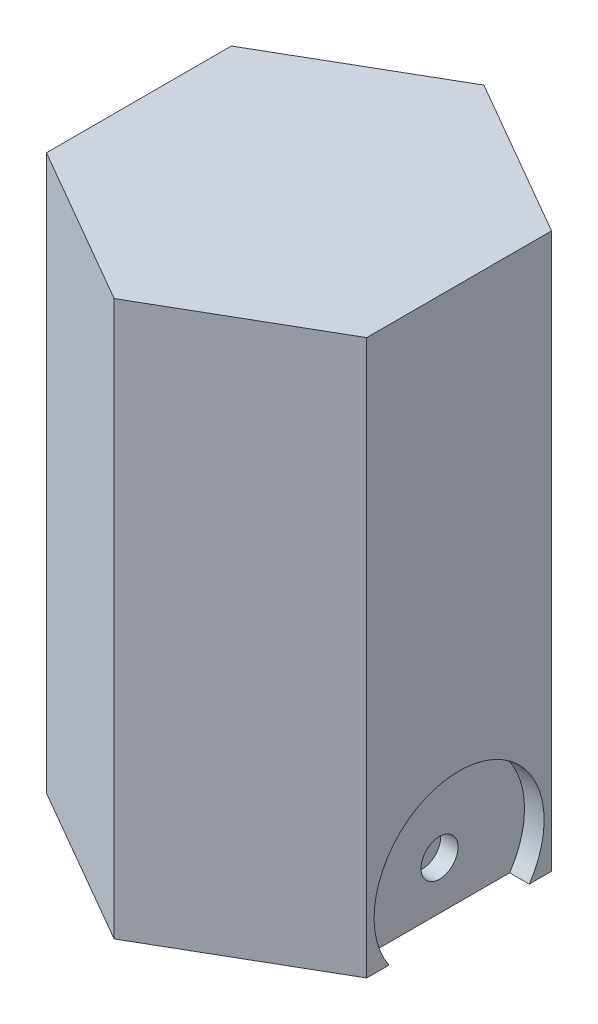
ISO-10303-21;
HEADER;
FILE_DESCRIPTION(('STEP AP214'),'2;1');
FILE_NAME('part.step','',(''),(''),'','','');
FILE_SCHEMA(('AUTOMOTIVE_DESIGN { 1 0 10303 214 1 1 1 1 }'));
ENDSEC;
DATA;
#1=APPLICATION_CONTEXT('core data for automotive mechanical design processes');
#2=APPLICATION_PROTOCOL_DEFINITION('international standard','automotive_design',2000,#1);
#3=PRODUCT_CONTEXT('',#1,'mechanical');
#4=PRODUCT('Part','Part','',(#3));
#5=PRODUCT_RELATED_PRODUCT_CATEGORY('part','',(#4));
#6=PRODUCT_DEFINITION_FORMATION('','',#4);
#7=PRODUCT_DEFINITION_CONTEXT('part definition',#1,'design');
#8=PRODUCT_DEFINITION('design','',#6,#7);
#9=PRODUCT_DEFINITION_SHAPE('','',#8);
#10=(LENGTH_UNIT() NAMED_UNIT(*) SI_UNIT(.MILLI.,.METRE.));
#11=(NAMED_UNIT(*) PLANE_ANGLE_UNIT() SI_UNIT($,.RADIAN.));
#12=(NAMED_UNIT(*) SI_UNIT($,.STERADIAN.) SOLID_ANGLE_UNIT());
#13=UNCERTAINTY_MEASURE_WITH_UNIT(LENGTH_MEASURE(1.E-05),#10,'distance_accuracy_value','');
#14=(GEOMETRIC_REPRESENTATION_CONTEXT(3) GLOBAL_UNCERTAINTY_ASSIGNED_CONTEXT((#13)) GLOBAL_UNIT_ASSIGNED_CONTEXT((#10,
#11,#12)) REPRESENTATION_CONTEXT('',''));
#15=CARTESIAN_POINT('',(0.,0.,0.));
#16=DIRECTION('',(0.,0.,1.));
#17=DIRECTION('',(1.,0.,0.));
#18=AXIS2_PLACEMENT_3D('',#15,#16,#17);
#19=CARTESIAN_POINT('',(43.3012701892219,160.,-25.));
#20=DIRECTION('',(-0.5,0.,0.866025403784439));
#21=DIRECTION('',(0.866025403784439,0.,0.5));
#22=AXIS2_PLACEMENT_3D('',#19,#20,#21);
#23=PLANE('',#22);
#24=DIRECTION('',(-0.866025403784439,0.,-0.5));
#25=VECTOR('',#24,1.);
#26=CARTESIAN_POINT('',(43.3012701892219,10.,-25.));
#27=LINE('',#26,#25);
#28=CARTESIAN_POINT('',(43.3012701892219,10.,-25.));
#29=VERTEX_POINT('',#28);
#30=CARTESIAN_POINT('',(0.,10.,-50.));
#31=VERTEX_POINT('',#30);
#32=EDGE_CURVE('E138',#29,#31,#27,.T.);
#33=ORIENTED_EDGE('',*,*,#32,.T.);
#34=DIRECTION('',(0.,-1.,0.));
#35=VECTOR('',#34,1.);
#36=CARTESIAN_POINT('',(0.,160.,-50.));
#37=LINE('',#36,#35);
#38=CARTESIAN_POINT('',(0.,160.,-50.));
#39=VERTEX_POINT('',#38);
#40=EDGE_CURVE('E182',#39,#31,#37,.T.);
#41=ORIENTED_EDGE('',*,*,#40,.F.);
#42=DIRECTION('',(-0.866025403784439,0.,-0.5));
#43=VECTOR('',#42,1.);
#44=CARTESIAN_POINT('',(43.3012701892219,160.,-25.));
#45=LINE('',#44,#43);
#46=CARTESIAN_POINT('',(43.3012701892219,160.,-25.));
#47=VERTEX_POINT('',#46);
#48=EDGE_CURVE('E139',#47,#39,#45,.T.);
#49=ORIENTED_EDGE('',*,*,#48,.F.);
#50=DIRECTION('',(0.,-1.,0.));
#51=VECTOR('',#50,1.);
#52=CARTESIAN_POINT('',(43.3012701892219,160.,-25.));
#53=LINE('',#52,#51);
#54=EDGE_CURVE('E153',#47,#29,#53,.T.);
#55=ORIENTED_EDGE('',*,*,#54,.T.);
#56=EDGE_LOOP('',(#33,#41,#49,#55));
#57=FACE_BOUND('',#56,.T.);
#58=ADVANCED_FACE('F32',(#57),#23,.F.);
#59=CARTESIAN_POINT('',(0.,160.,-50.));
#60=DIRECTION('',(0.5,0.,0.866025403784439));
#61=DIRECTION('',(0.866025403784439,0.,-0.5));
#62=AXIS2_PLACEMENT_3D('',#59,#60,#61);
#63=PLANE('',#62);
#64=DIRECTION('',(-0.866025403784439,0.,0.5));
#65=VECTOR('',#64,1.);
#66=CARTESIAN_POINT('',(0.,10.,-50.));
#67=LINE('',#66,#65);
#68=CARTESIAN_POINT('',(-43.3012701892219,10.,-25.));
#69=VERTEX_POINT('',#68);
#70=EDGE_CURVE('E156',#31,#69,#67,.T.);
#71=ORIENTED_EDGE('',*,*,#70,.T.);
#72=DIRECTION('',(0.,-1.,0.));
#73=VECTOR('',#72,1.);
#74=CARTESIAN_POINT('',(-43.3012701892219,160.,-25.));
#75=LINE('',#74,#73);
#76=CARTESIAN_POINT('',(-43.3012701892219,160.,-25.));
#77=VERTEX_POINT('',#76);
#78=EDGE_CURVE('E179',#77,#69,#75,.T.);
#79=ORIENTED_EDGE('',*,*,#78,.F.);
#80=DIRECTION('',(-0.866025403784439,0.,0.5));
#81=VECTOR('',#80,1.);
#82=CARTESIAN_POINT('',(0.,160.,-50.));
#83=LINE('',#82,#81);
#84=EDGE_CURVE('E142',#39,#77,#83,.T.);
#85=ORIENTED_EDGE('',*,*,#84,.F.);
#86=ORIENTED_EDGE('',*,*,#40,.T.);
#87=EDGE_LOOP('',(#71,#79,#85,#86));
#88=FACE_BOUND('',#87,.T.);
#89=ADVANCED_FACE('F198',(#88),#63,.F.);
#90=CARTESIAN_POINT('',(-43.3012701892219,160.,-25.));
#91=DIRECTION('',(1.,0.,0.));
#92=DIRECTION('',(0.,0.,-1.));
#93=AXIS2_PLACEMENT_3D('',#90,#91,#92);
#94=PLANE('',#93);
#95=DIRECTION('',(0.,0.,1.));
#96=VECTOR('',#95,1.);
#97=CARTESIAN_POINT('',(-43.3012701892219,10.,-25.));
#98=LINE('',#97,#96);
#99=CARTESIAN_POINT('',(-43.3012701892219,10.,-18.9736659610103));
#100=VERTEX_POINT('',#99);
#101=EDGE_CURVE('E159',#69,#100,#98,.T.);
#102=ORIENTED_EDGE('',*,*,#101,.T.);
#103=CARTESIAN_POINT('',(-43.3012701892219,23.,0.));
#104=DIRECTION('',(1.,0.,0.));
#105=DIRECTION('',(0.,0.,-1.));
#106=AXIS2_PLACEMENT_3D('',#103,#104,#105);
#107=CIRCLE('',#106,23.);
#108=CARTESIAN_POINT('',(-43.3012701892219,10.,18.9736659610103));
#109=VERTEX_POINT('',#108);
#110=EDGE_CURVE('E136',#109,#100,#107,.F.);
#111=ORIENTED_EDGE('',*,*,#110,.F.);
#112=CARTESIAN_POINT('',(-43.3012701892219,10.,25.));
#113=VERTEX_POINT('',#112);
#114=EDGE_CURVE('E158',#109,#113,#98,.T.);
#115=ORIENTED_EDGE('',*,*,#114,.T.);
#116=DIRECTION('',(0.,-1.,0.));
#117=VECTOR('',#116,1.);
#118=CARTESIAN_POINT('',(-43.3012701892219,160.,25.));
#119=LINE('',#118,#117);
#120=CARTESIAN_POINT('',(-43.3012701892219,160.,25.));
#121=VERTEX_POINT('',#120);
#122=EDGE_CURVE('E176',#121,#113,#119,.T.);
#123=ORIENTED_EDGE('',*,*,#122,.F.);
#124=DIRECTION('',(0.,0.,1.));
#125=VECTOR('',#124,1.);
#126=CARTESIAN_POINT('',(-43.3012701892219,160.,-25.));
#127=LINE('',#126,#125);
#128=EDGE_CURVE('E145',#77,#121,#127,.T.);
#129=ORIENTED_EDGE('',*,*,#128,.F.);
#130=ORIENTED_EDGE('',*,*,#78,.T.);
#131=EDGE_LOOP('',(#102,#111,#115,#123,#129,#130));
#132=FACE_BOUND('',#131,.T.);
#133=ADVANCED_FACE('F192',(#132),#94,.F.);
#134=CARTESIAN_POINT('',(-43.3012701892219,160.,25.));
#135=DIRECTION('',(0.5,0.,-0.866025403784438));
#136=DIRECTION('',(-0.866025403784439,0.,-0.5));
#137=AXIS2_PLACEMENT_3D('',#134,#135,#136);
#138=PLANE('',#137);
#139=DIRECTION('',(0.866025403784438,0.,0.5));
#140=VECTOR('',#139,1.);
#141=CARTESIAN_POINT('',(-43.3012701892219,10.,25.));
#142=LINE('',#141,#140);
#143=CARTESIAN_POINT('',(0.,10.,50.));
#144=VERTEX_POINT('',#143);
#145=EDGE_CURVE('E162',#113,#144,#142,.T.);
#146=ORIENTED_EDGE('',*,*,#145,.T.);
#147=DIRECTION('',(0.,-1.,0.));
#148=VECTOR('',#147,1.);
#149=CARTESIAN_POINT('',(0.,160.,50.));
#150=LINE('',#149,#148);
#151=CARTESIAN_POINT('',(0.,160.,50.));
#152=VERTEX_POINT('',#151);
#153=EDGE_CURVE('E173',#152,#144,#150,.T.);
#154=ORIENTED_EDGE('',*,*,#153,.F.);
#155=DIRECTION('',(0.866025403784438,0.,0.5));
#156=VECTOR('',#155,1.);
#157=CARTESIAN_POINT('',(-43.3012701892219,160.,25.));
#158=LINE('',#157,#156);
#159=EDGE_CURVE('E147',#121,#152,#158,.T.);
#160=ORIENTED_EDGE('',*,*,#159,.F.);
#161=ORIENTED_EDGE('',*,*,#122,.T.);
#162=EDGE_LOOP('',(#146,#154,#160,#161));
#163=FACE_BOUND('',#162,.T.);
#164=ADVANCED_FACE('F216',(#163),#138,.F.);
#165=CARTESIAN_POINT('',(0.,160.,50.));
#166=DIRECTION('',(-0.5,0.,-0.866025403784439));
#167=DIRECTION('',(-0.866025403784439,0.,0.5));
#168=AXIS2_PLACEMENT_3D('',#165,#166,#167);
#169=PLANE('',#168);
#170=DIRECTION('',(0.866025403784439,0.,-0.5));
#171=VECTOR('',#170,1.);
#172=CARTESIAN_POINT('',(0.,10.,50.));
#173=LINE('',#172,#171);
#174=CARTESIAN_POINT('',(43.3012701892219,10.,25.));
#175=VERTEX_POINT('',#174);
#176=EDGE_CURVE('E164',#144,#175,#173,.T.);
#177=ORIENTED_EDGE('',*,*,#176,.T.);
#178=DIRECTION('',(0.,-1.,0.));
#179=VECTOR('',#178,1.);
#180=CARTESIAN_POINT('',(43.3012701892219,160.,25.));
#181=LINE('',#180,#179);
#182=CARTESIAN_POINT('',(43.3012701892219,160.,25.));
#183=VERTEX_POINT('',#182);
#184=EDGE_CURVE('E170',#183,#175,#181,.T.);
#185=ORIENTED_EDGE('',*,*,#184,.F.);
#186=DIRECTION('',(0.866025403784439,0.,-0.5));
#187=VECTOR('',#186,1.);
#188=CARTESIAN_POINT('',(0.,160.,50.));
#189=LINE('',#188,#187);
#190=EDGE_CURVE('E149',#152,#183,#189,.T.);
#191=ORIENTED_EDGE('',*,*,#190,.F.);
#192=ORIENTED_EDGE('',*,*,#153,.T.);
#193=EDGE_LOOP('',(#177,#185,#191,#192));
#194=FACE_BOUND('',#193,.T.);
#195=ADVANCED_FACE('F211',(#194),#169,.F.);
#196=CARTESIAN_POINT('',(43.3012701892219,160.,25.));
#197=DIRECTION('',(-1.,0.,0.));
#198=DIRECTION('',(0.,0.,1.));
#199=AXIS2_PLACEMENT_3D('',#196,#197,#198);
#200=PLANE('',#199);
#201=DIRECTION('',(0.,0.,-1.));
#202=VECTOR('',#201,1.);
#203=CARTESIAN_POINT('',(43.3012701892219,10.,25.));
#204=LINE('',#203,#202);
#205=CARTESIAN_POINT('',(43.3012701892219,10.,18.9736659610103));
#206=VERTEX_POINT('',#205);
#207=EDGE_CURVE('E143',#175,#206,#204,.T.);
#208=ORIENTED_EDGE('',*,*,#207,.T.);
#209=CARTESIAN_POINT('',(43.3012701892219,23.,0.));
#210=DIRECTION('',(1.,0.,0.));
#211=DIRECTION('',(0.,0.,-1.));
#212=AXIS2_PLACEMENT_3D('',#209,#210,#211);
#213=CIRCLE('',#212,23.);
#214=CARTESIAN_POINT('',(43.3012701892219,10.,-18.9736659610103));
#215=VERTEX_POINT('',#214);
#216=EDGE_CURVE('E113',#206,#215,#213,.F.);
#217=ORIENTED_EDGE('',*,*,#216,.T.);
#218=EDGE_CURVE('E124',#215,#29,#204,.T.);
#219=ORIENTED_EDGE('',*,*,#218,.T.);
#220=ORIENTED_EDGE('',*,*,#54,.F.);
#221=DIRECTION('',(0.,0.,-1.));
#222=VECTOR('',#221,1.);
#223=CARTESIAN_POINT('',(43.3012701892219,160.,25.));
#224=LINE('',#223,#222);
#225=EDGE_CURVE('E151',#183,#47,#224,.T.);
#226=ORIENTED_EDGE('',*,*,#225,.F.);
#227=ORIENTED_EDGE('',*,*,#184,.T.);
#228=EDGE_LOOP('',(#208,#217,#219,#220,#226,#227));
#229=FACE_BOUND('',#228,.T.);
#230=ADVANCED_FACE('F205',(#229),#200,.F.);
#231=CARTESIAN_POINT('',(0.,160.,0.));
#232=DIRECTION('',(0.,1.,0.));
#233=DIRECTION('',(0.,0.,1.));
#234=AXIS2_PLACEMENT_3D('',#231,#232,#233);
#235=PLANE('',#234);
#236=ORIENTED_EDGE('',*,*,#48,.T.);
#237=ORIENTED_EDGE('',*,*,#84,.T.);
#238=ORIENTED_EDGE('',*,*,#128,.T.);
#239=ORIENTED_EDGE('',*,*,#159,.T.);
#240=ORIENTED_EDGE('',*,*,#190,.T.);
#241=ORIENTED_EDGE('',*,*,#225,.T.);
#242=EDGE_LOOP('',(#236,#237,#238,#239,#240,#241));
#243=FACE_BOUND('',#242,.T.);
#244=ADVANCED_FACE('F228',(#243),#235,.T.);
#245=CARTESIAN_POINT('',(0.,10.,0.));
#246=DIRECTION('',(0.,1.,0.));
#247=DIRECTION('',(0.,0.,1.));
#248=AXIS2_PLACEMENT_3D('',#245,#246,#247);
#249=PLANE('',#248);
#250=ORIENTED_EDGE('',*,*,#218,.F.);
#251=DIRECTION('',(-1.,0.,0.));
#252=VECTOR('',#251,1.);
#253=CARTESIAN_POINT('',(108.355094058384,10.,-18.9736659610103));
#254=LINE('',#253,#252);
#255=CARTESIAN_POINT('',(38.,10.,-18.9736659610103));
#256=VERTEX_POINT('',#255);
#257=EDGE_CURVE('E109',#256,#215,#254,.F.);
#258=ORIENTED_EDGE('',*,*,#257,.F.);
#259=DIRECTION('',(0.,0.,-1.));
#260=VECTOR('',#259,1.);
#261=CARTESIAN_POINT('',(38.,10.,0.));
#262=LINE('',#261,#260);
#263=CARTESIAN_POINT('',(38.,10.,18.9736659610103));
#264=VERTEX_POINT('',#263);
#265=EDGE_CURVE('E116',#264,#256,#262,.T.);
#266=ORIENTED_EDGE('',*,*,#265,.F.);
#267=DIRECTION('',(-1.,0.,0.));
#268=VECTOR('',#267,1.);
#269=CARTESIAN_POINT('',(108.355094058384,10.,18.9736659610103));
#270=LINE('',#269,#268);
#271=EDGE_CURVE('E46',#206,#264,#270,.T.);
#272=ORIENTED_EDGE('',*,*,#271,.F.);
#273=ORIENTED_EDGE('',*,*,#207,.F.);
#274=ORIENTED_EDGE('',*,*,#176,.F.);
#275=ORIENTED_EDGE('',*,*,#145,.F.);
#276=ORIENTED_EDGE('',*,*,#114,.F.);
#277=DIRECTION('',(1.,0.,0.));
#278=VECTOR('',#277,1.);
#279=CARTESIAN_POINT('',(-108.355094058384,10.,18.9736659610103));
#280=LINE('',#279,#278);
#281=CARTESIAN_POINT('',(-38.,10.,18.9736659610103));
#282=VERTEX_POINT('',#281);
#283=EDGE_CURVE('E11',#109,#282,#280,.T.);
#284=ORIENTED_EDGE('',*,*,#283,.T.);
#285=DIRECTION('',(0.,0.,-1.));
#286=VECTOR('',#285,1.);
#287=CARTESIAN_POINT('',(-38.,10.,0.));
#288=LINE('',#287,#286);
#289=CARTESIAN_POINT('',(-38.,10.,-18.9736659610103));
#290=VERTEX_POINT('',#289);
#291=EDGE_CURVE('E185',#282,#290,#288,.T.);
#292=ORIENTED_EDGE('',*,*,#291,.T.);
#293=DIRECTION('',(1.,0.,0.));
#294=VECTOR('',#293,1.);
#295=CARTESIAN_POINT('',(-108.355094058384,10.,-18.9736659610103));
#296=LINE('',#295,#294);
#297=EDGE_CURVE('E39',#290,#100,#296,.F.);
#298=ORIENTED_EDGE('',*,*,#297,.T.);
#299=ORIENTED_EDGE('',*,*,#101,.F.);
#300=ORIENTED_EDGE('',*,*,#70,.F.);
#301=ORIENTED_EDGE('',*,*,#32,.F.);
#302=EDGE_LOOP('',(#250,#258,#266,#272,#273,#274,#275,#276,#284,#292,#298,#299,#300,#301));
#303=FACE_BOUND('',#302,.T.);
#304=ADVANCED_FACE('F122',(#303),#249,.F.);
#305=CARTESIAN_POINT('',(-108.355094058384,23.,0.));
#306=DIRECTION('',(1.,0.,0.));
#307=DIRECTION('',(0.,0.,-1.));
#308=AXIS2_PLACEMENT_3D('',#305,#306,#307);
#309=CYLINDRICAL_SURFACE('',#308,23.);
#310=ORIENTED_EDGE('',*,*,#110,.T.);
#311=ORIENTED_EDGE('',*,*,#297,.F.);
#312=CARTESIAN_POINT('',(-38.,23.,0.));
#313=DIRECTION('',(1.,0.,0.));
#314=DIRECTION('',(0.,0.,-1.));
#315=AXIS2_PLACEMENT_3D('',#312,#313,#314);
#316=CIRCLE('',#315,23.);
#317=EDGE_CURVE('E53',#290,#282,#316,.T.);
#318=ORIENTED_EDGE('',*,*,#317,.T.);
#319=ORIENTED_EDGE('',*,*,#283,.F.);
#320=EDGE_LOOP('',(#310,#311,#318,#319));
#321=FACE_BOUND('',#320,.T.);
#322=ADVANCED_FACE('F217',(#321),#309,.F.);
#323=CARTESIAN_POINT('',(-38.,23.,0.));
#324=DIRECTION('',(1.,0.,0.));
#325=DIRECTION('',(0.,0.,-1.));
#326=AXIS2_PLACEMENT_3D('',#323,#324,#325);
#327=PLANE('',#326);
#328=CARTESIAN_POINT('',(-38.,23.,0.));
#329=DIRECTION('',(1.,0.,0.));
#330=DIRECTION('',(0.,0.,-1.));
#331=AXIS2_PLACEMENT_3D('',#328,#329,#330);
#332=CIRCLE('',#331,5.);
#333=CARTESIAN_POINT('',(-38.,23.,-5.));
#334=VERTEX_POINT('',#333);
#335=EDGE_CURVE('E132',#334,#334,#332,.F.);
#336=ORIENTED_EDGE('',*,*,#335,.F.);
#337=EDGE_LOOP('',(#336));
#338=FACE_BOUND('',#337,.T.);
#339=ORIENTED_EDGE('',*,*,#317,.F.);
#340=ORIENTED_EDGE('',*,*,#291,.F.);
#341=EDGE_LOOP('',(#339,#340));
#342=FACE_BOUND('',#341,.T.);
#343=ADVANCED_FACE('F219',(#338,#342),#327,.F.);
#344=CARTESIAN_POINT('',(-52.142135623731,23.,0.));
#345=DIRECTION('',(1.,0.,0.));
#346=DIRECTION('',(0.,0.,-1.));
#347=AXIS2_PLACEMENT_3D('',#344,#345,#346);
#348=CYLINDRICAL_SURFACE('',#347,5.);
#349=ORIENTED_EDGE('',*,*,#335,.T.);
#350=EDGE_LOOP('',(#349));
#351=FACE_BOUND('',#350,.T.);
#352=CARTESIAN_POINT('',(-33.3,23.,0.));
#353=DIRECTION('',(1.,0.,0.));
#354=DIRECTION('',(0.,0.,-1.));
#355=AXIS2_PLACEMENT_3D('',#352,#353,#354);
#356=CIRCLE('',#355,5.);
#357=CARTESIAN_POINT('',(-33.3,23.,-5.));
#358=VERTEX_POINT('',#357);
#359=EDGE_CURVE('E126',#358,#358,#356,.T.);
#360=ORIENTED_EDGE('',*,*,#359,.T.);
#361=EDGE_LOOP('',(#360));
#362=FACE_BOUND('',#361,.T.);
#363=ADVANCED_FACE('F225',(#351,#362),#348,.F.);
#364=CARTESIAN_POINT('',(-33.3,23.,0.));
#365=DIRECTION('',(1.,0.,0.));
#366=DIRECTION('',(0.,0.,-1.));
#367=AXIS2_PLACEMENT_3D('',#364,#365,#366);
#368=PLANE('',#367);
#369=ORIENTED_EDGE('',*,*,#359,.F.);
#370=EDGE_LOOP('',(#369));
#371=FACE_BOUND('',#370,.T.);
#372=ADVANCED_FACE('F270',(#371),#368,.F.);
#373=CARTESIAN_POINT('',(108.355094058384,23.,0.));
#374=DIRECTION('',(-1.,0.,0.));
#375=DIRECTION('',(0.,0.,-1.));
#376=AXIS2_PLACEMENT_3D('',#373,#374,#375);
#377=CYLINDRICAL_SURFACE('',#376,23.);
#378=ORIENTED_EDGE('',*,*,#216,.F.);
#379=ORIENTED_EDGE('',*,*,#271,.T.);
#380=CARTESIAN_POINT('',(38.,23.,0.));
#381=DIRECTION('',(1.,0.,0.));
#382=DIRECTION('',(0.,0.,-1.));
#383=AXIS2_PLACEMENT_3D('',#380,#381,#382);
#384=CIRCLE('',#383,23.);
#385=EDGE_CURVE('E105',#256,#264,#384,.T.);
#386=ORIENTED_EDGE('',*,*,#385,.F.);
#387=ORIENTED_EDGE('',*,*,#257,.T.);
#388=EDGE_LOOP('',(#378,#379,#386,#387));
#389=FACE_BOUND('',#388,.T.);
#390=ADVANCED_FACE('F107',(#389),#377,.F.);
#391=CARTESIAN_POINT('',(38.,23.,0.));
#392=DIRECTION('',(-1.,0.,0.));
#393=DIRECTION('',(0.,0.,-1.));
#394=AXIS2_PLACEMENT_3D('',#391,#392,#393);
#395=PLANE('',#394);
#396=CARTESIAN_POINT('',(38.,23.,0.));
#397=DIRECTION('',(1.,0.,0.));
#398=DIRECTION('',(0.,0.,-1.));
#399=AXIS2_PLACEMENT_3D('',#396,#397,#398);
#400=CIRCLE('',#399,5.);
#401=CARTESIAN_POINT('',(38.,23.,-5.));
#402=VERTEX_POINT('',#401);
#403=EDGE_CURVE('E114',#402,#402,#400,.F.);
#404=ORIENTED_EDGE('',*,*,#403,.T.);
#405=EDGE_LOOP('',(#404));
#406=FACE_BOUND('',#405,.T.);
#407=ORIENTED_EDGE('',*,*,#385,.T.);
#408=ORIENTED_EDGE('',*,*,#265,.T.);
#409=EDGE_LOOP('',(#407,#408));
#410=FACE_BOUND('',#409,.T.);
#411=ADVANCED_FACE('F117',(#406,#410),#395,.F.);
#412=CARTESIAN_POINT('',(52.142135623731,23.,0.));
#413=DIRECTION('',(-1.,0.,0.));
#414=DIRECTION('',(0.,0.,-1.));
#415=AXIS2_PLACEMENT_3D('',#412,#413,#414);
#416=CYLINDRICAL_SURFACE('',#415,5.);
#417=ORIENTED_EDGE('',*,*,#403,.F.);
#418=EDGE_LOOP('',(#417));
#419=FACE_BOUND('',#418,.T.);
#420=CARTESIAN_POINT('',(33.3,23.,0.));
#421=DIRECTION('',(1.,0.,0.));
#422=DIRECTION('',(0.,0.,-1.));
#423=AXIS2_PLACEMENT_3D('',#420,#421,#422);
#424=CIRCLE('',#423,5.);
#425=CARTESIAN_POINT('',(33.3,23.,-5.));
#426=VERTEX_POINT('',#425);
#427=EDGE_CURVE('E119',#426,#426,#424,.T.);
#428=ORIENTED_EDGE('',*,*,#427,.F.);
#429=EDGE_LOOP('',(#428));
#430=FACE_BOUND('',#429,.T.);
#431=ADVANCED_FACE('F281',(#419,#430),#416,.F.);
#432=CARTESIAN_POINT('',(33.3,23.,0.));
#433=DIRECTION('',(-1.,0.,0.));
#434=DIRECTION('',(0.,0.,-1.));
#435=AXIS2_PLACEMENT_3D('',#432,#433,#434);
#436=PLANE('',#435);
#437=ORIENTED_EDGE('',*,*,#427,.T.);
#438=EDGE_LOOP('',(#437));
#439=FACE_BOUND('',#438,.T.);
#440=ADVANCED_FACE('F291',(#439),#436,.F.);
#441=CLOSED_SHELL('',(#58,#89,#133,#164,#195,#230,#244,#304,#322,#343,#363,#372,#390,#411,#431,#440));
#442=MANIFOLD_SOLID_BREP('B2',#441);
#443=ADVANCED_BREP_SHAPE_REPRESENTATION('',(#18,#442),#14);
#444=SHAPE_DEFINITION_REPRESENTATION(#9,#443);
ENDSEC;
END-ISO-10303-21;
